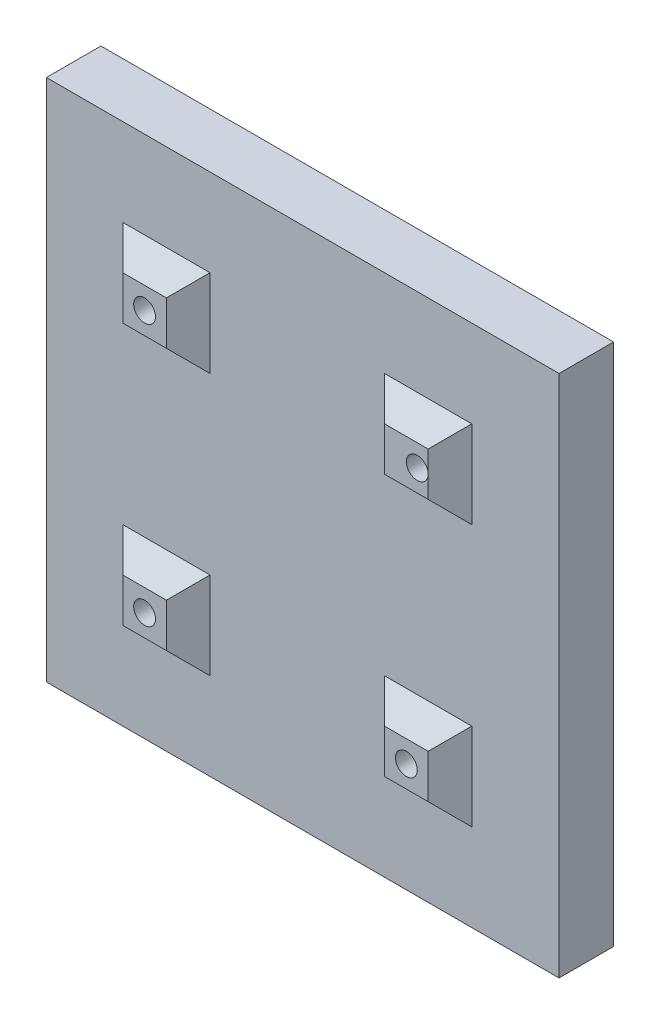
ISO-10303-21;
HEADER;
FILE_DESCRIPTION(('STEP AP214'),'2;1');
FILE_NAME('part.step','',(''),(''),'','','');
FILE_SCHEMA(('AUTOMOTIVE_DESIGN { 1 0 10303 214 1 1 1 1 }'));
ENDSEC;
DATA;
#1=APPLICATION_CONTEXT('core data for automotive mechanical design processes');
#2=APPLICATION_PROTOCOL_DEFINITION('international standard','automotive_design',2000,#1);
#3=PRODUCT_CONTEXT('',#1,'mechanical');
#4=PRODUCT('Part','Part','',(#3));
#5=PRODUCT_RELATED_PRODUCT_CATEGORY('part','',(#4));
#6=PRODUCT_DEFINITION_FORMATION('','',#4);
#7=PRODUCT_DEFINITION_CONTEXT('part definition',#1,'design');
#8=PRODUCT_DEFINITION('design','',#6,#7);
#9=PRODUCT_DEFINITION_SHAPE('','',#8);
#10=(LENGTH_UNIT() NAMED_UNIT(*) SI_UNIT(.MILLI.,.METRE.));
#11=(NAMED_UNIT(*) PLANE_ANGLE_UNIT() SI_UNIT($,.RADIAN.));
#12=(NAMED_UNIT(*) SI_UNIT($,.STERADIAN.) SOLID_ANGLE_UNIT());
#13=UNCERTAINTY_MEASURE_WITH_UNIT(LENGTH_MEASURE(1.E-05),#10,'distance_accuracy_value','');
#14=(GEOMETRIC_REPRESENTATION_CONTEXT(3) GLOBAL_UNCERTAINTY_ASSIGNED_CONTEXT((#13)) GLOBAL_UNIT_ASSIGNED_CONTEXT((#10,
#11,#12)) REPRESENTATION_CONTEXT('',''));
#15=CARTESIAN_POINT('',(0.,0.,0.));
#16=DIRECTION('',(0.,0.,1.));
#17=DIRECTION('',(1.,0.,0.));
#18=AXIS2_PLACEMENT_3D('',#15,#16,#17);
#19=CARTESIAN_POINT('',(11.75,12.,3.5));
#20=DIRECTION('',(-1.,0.,0.));
#21=DIRECTION('',(0.,-1.,0.));
#22=AXIS2_PLACEMENT_3D('',#19,#20,#21);
#23=PLANE('',#22);
#24=DIRECTION('',(0.,1.,0.));
#25=VECTOR('',#24,1.);
#26=CARTESIAN_POINT('',(11.75,12.,2.5));
#27=LINE('',#26,#25);
#28=CARTESIAN_POINT('',(11.75,-12.,2.5));
#29=VERTEX_POINT('',#28);
#30=CARTESIAN_POINT('',(11.75,12.,2.5));
#31=VERTEX_POINT('',#30);
#32=EDGE_CURVE('E187',#29,#31,#27,.T.);
#33=ORIENTED_EDGE('',*,*,#32,.F.);
#34=DIRECTION('',(0.,0.,-1.));
#35=VECTOR('',#34,1.);
#36=CARTESIAN_POINT('',(11.75,-12.,3.5));
#37=LINE('',#36,#35);
#38=CARTESIAN_POINT('',(11.75,-12.,0.));
#39=VERTEX_POINT('',#38);
#40=EDGE_CURVE('E199',#29,#39,#37,.T.);
#41=ORIENTED_EDGE('',*,*,#40,.T.);
#42=DIRECTION('',(0.,1.,0.));
#43=VECTOR('',#42,1.);
#44=CARTESIAN_POINT('',(11.75,12.,0.));
#45=LINE('',#44,#43);
#46=CARTESIAN_POINT('',(11.75,12.,0.));
#47=VERTEX_POINT('',#46);
#48=EDGE_CURVE('E198',#39,#47,#45,.T.);
#49=ORIENTED_EDGE('',*,*,#48,.T.);
#50=DIRECTION('',(0.,0.,-1.));
#51=VECTOR('',#50,1.);
#52=CARTESIAN_POINT('',(11.75,12.,3.5));
#53=LINE('',#52,#51);
#54=EDGE_CURVE('E11',#31,#47,#53,.T.);
#55=ORIENTED_EDGE('',*,*,#54,.F.);
#56=EDGE_LOOP('',(#33,#41,#49,#55));
#57=FACE_BOUND('',#56,.T.);
#58=ADVANCED_FACE('F41',(#57),#23,.F.);
#59=CARTESIAN_POINT('',(-11.75,12.,3.5));
#60=DIRECTION('',(0.,-1.,0.));
#61=DIRECTION('',(0.,0.,-1.));
#62=AXIS2_PLACEMENT_3D('',#59,#60,#61);
#63=PLANE('',#62);
#64=DIRECTION('',(-1.,0.,0.));
#65=VECTOR('',#64,1.);
#66=CARTESIAN_POINT('',(-12.25,12.,2.5));
#67=LINE('',#66,#65);
#68=CARTESIAN_POINT('',(-11.75,12.,2.5));
#69=VERTEX_POINT('',#68);
#70=EDGE_CURVE('E179',#31,#69,#67,.T.);
#71=ORIENTED_EDGE('',*,*,#70,.F.);
#72=ORIENTED_EDGE('',*,*,#54,.T.);
#73=DIRECTION('',(-1.,0.,0.));
#74=VECTOR('',#73,1.);
#75=CARTESIAN_POINT('',(-11.75,12.,0.));
#76=LINE('',#75,#74);
#77=CARTESIAN_POINT('',(-11.75,12.,0.));
#78=VERTEX_POINT('',#77);
#79=EDGE_CURVE('E203',#47,#78,#76,.T.);
#80=ORIENTED_EDGE('',*,*,#79,.T.);
#81=DIRECTION('',(0.,0.,-1.));
#82=VECTOR('',#81,1.);
#83=CARTESIAN_POINT('',(-11.75,12.,3.5));
#84=LINE('',#83,#82);
#85=EDGE_CURVE('E49',#69,#78,#84,.T.);
#86=ORIENTED_EDGE('',*,*,#85,.F.);
#87=EDGE_LOOP('',(#71,#72,#80,#86));
#88=FACE_BOUND('',#87,.T.);
#89=ADVANCED_FACE('F181',(#88),#63,.F.);
#90=CARTESIAN_POINT('',(-11.75,12.,3.5));
#91=DIRECTION('',(1.,0.,0.));
#92=DIRECTION('',(0.,1.,0.));
#93=AXIS2_PLACEMENT_3D('',#90,#91,#92);
#94=PLANE('',#93);
#95=DIRECTION('',(0.,-1.,0.));
#96=VECTOR('',#95,1.);
#97=CARTESIAN_POINT('',(-11.75,12.,2.5));
#98=LINE('',#97,#96);
#99=CARTESIAN_POINT('',(-11.75,-12.,2.5));
#100=VERTEX_POINT('',#99);
#101=EDGE_CURVE('E62',#69,#100,#98,.T.);
#102=ORIENTED_EDGE('',*,*,#101,.F.);
#103=ORIENTED_EDGE('',*,*,#85,.T.);
#104=DIRECTION('',(0.,-1.,0.));
#105=VECTOR('',#104,1.);
#106=CARTESIAN_POINT('',(-11.75,12.,0.));
#107=LINE('',#106,#105);
#108=CARTESIAN_POINT('',(-11.75,-12.,0.));
#109=VERTEX_POINT('',#108);
#110=EDGE_CURVE('E205',#78,#109,#107,.T.);
#111=ORIENTED_EDGE('',*,*,#110,.T.);
#112=DIRECTION('',(0.,0.,-1.));
#113=VECTOR('',#112,1.);
#114=CARTESIAN_POINT('',(-11.75,-12.,3.5));
#115=LINE('',#114,#113);
#116=EDGE_CURVE('E216',#100,#109,#115,.T.);
#117=ORIENTED_EDGE('',*,*,#116,.F.);
#118=EDGE_LOOP('',(#102,#103,#111,#117));
#119=FACE_BOUND('',#118,.T.);
#120=ADVANCED_FACE('F443',(#119),#94,.F.);
#121=CARTESIAN_POINT('',(-11.75,-12.,3.5));
#122=DIRECTION('',(0.,1.,0.));
#123=DIRECTION('',(0.,0.,1.));
#124=AXIS2_PLACEMENT_3D('',#121,#122,#123);
#125=PLANE('',#124);
#126=DIRECTION('',(1.,0.,0.));
#127=VECTOR('',#126,1.);
#128=CARTESIAN_POINT('',(-12.25,-12.,2.5));
#129=LINE('',#128,#127);
#130=EDGE_CURVE('E186',#100,#29,#129,.T.);
#131=ORIENTED_EDGE('',*,*,#130,.F.);
#132=ORIENTED_EDGE('',*,*,#116,.T.);
#133=DIRECTION('',(1.,0.,0.));
#134=VECTOR('',#133,1.);
#135=CARTESIAN_POINT('',(-11.75,-12.,0.));
#136=LINE('',#135,#134);
#137=EDGE_CURVE('E213',#109,#39,#136,.T.);
#138=ORIENTED_EDGE('',*,*,#137,.T.);
#139=ORIENTED_EDGE('',*,*,#40,.F.);
#140=EDGE_LOOP('',(#131,#132,#138,#139));
#141=FACE_BOUND('',#140,.T.);
#142=ADVANCED_FACE('F447',(#141),#125,.F.);
#143=CARTESIAN_POINT('',(0.,0.,0.));
#144=DIRECTION('',(0.,0.,1.));
#145=DIRECTION('',(1.,0.,0.));
#146=AXIS2_PLACEMENT_3D('',#143,#144,#145);
#147=PLANE('',#146);
#148=CARTESIAN_POINT('',(-6.25,-6.,0.));
#149=DIRECTION('',(0.,0.,1.));
#150=DIRECTION('',(1.,0.,0.));
#151=AXIS2_PLACEMENT_3D('',#148,#149,#150);
#152=CIRCLE('',#151,0.499999999999997);
#153=CARTESIAN_POINT('',(-5.75,-6.,0.));
#154=VERTEX_POINT('',#153);
#155=EDGE_CURVE('E44',#154,#154,#152,.T.);
#156=ORIENTED_EDGE('',*,*,#155,.T.);
#157=EDGE_LOOP('',(#156));
#158=FACE_BOUND('',#157,.T.);
#159=CARTESIAN_POINT('',(-6.25,6.,0.));
#160=DIRECTION('',(0.,0.,1.));
#161=DIRECTION('',(1.,0.,0.));
#162=AXIS2_PLACEMENT_3D('',#159,#160,#161);
#163=CIRCLE('',#162,0.499999999999998);
#164=CARTESIAN_POINT('',(-5.75,6.,0.));
#165=VERTEX_POINT('',#164);
#166=EDGE_CURVE('E218',#165,#165,#163,.T.);
#167=ORIENTED_EDGE('',*,*,#166,.T.);
#168=EDGE_LOOP('',(#167));
#169=FACE_BOUND('',#168,.T.);
#170=CARTESIAN_POINT('',(6.25000000000001,5.99999999999999,0.));
#171=DIRECTION('',(0.,0.,1.));
#172=DIRECTION('',(1.,0.,0.));
#173=AXIS2_PLACEMENT_3D('',#170,#171,#172);
#174=CIRCLE('',#173,0.499999999999998);
#175=CARTESIAN_POINT('',(6.75000000000001,5.99999999999999,0.));
#176=VERTEX_POINT('',#175);
#177=EDGE_CURVE('E223',#176,#176,#174,.T.);
#178=ORIENTED_EDGE('',*,*,#177,.T.);
#179=EDGE_LOOP('',(#178));
#180=FACE_BOUND('',#179,.T.);
#181=CARTESIAN_POINT('',(5.74999999999999,-6.,0.));
#182=DIRECTION('',(0.,0.,1.));
#183=DIRECTION('',(1.,0.,0.));
#184=AXIS2_PLACEMENT_3D('',#181,#182,#183);
#185=CIRCLE('',#184,0.499999999999998);
#186=CARTESIAN_POINT('',(6.24999999999999,-6.,0.));
#187=VERTEX_POINT('',#186);
#188=EDGE_CURVE('E238',#187,#187,#185,.T.);
#189=ORIENTED_EDGE('',*,*,#188,.T.);
#190=EDGE_LOOP('',(#189));
#191=FACE_BOUND('',#190,.T.);
#192=ORIENTED_EDGE('',*,*,#48,.F.);
#193=ORIENTED_EDGE('',*,*,#137,.F.);
#194=ORIENTED_EDGE('',*,*,#110,.F.);
#195=ORIENTED_EDGE('',*,*,#79,.F.);
#196=EDGE_LOOP('',(#192,#193,#194,#195));
#197=FACE_BOUND('',#196,.T.);
#198=ADVANCED_FACE('F453',(#158,#169,#180,#191,#197),#147,.F.);
#199=CARTESIAN_POINT('',(-0.250000000000002,0.,2.5));
#200=DIRECTION('',(0.,0.,1.));
#201=DIRECTION('',(1.,0.,0.));
#202=AXIS2_PLACEMENT_3D('',#199,#200,#201);
#203=PLANE('',#202);
#204=DIRECTION('',(0.,-1.,0.));
#205=VECTOR('',#204,1.);
#206=CARTESIAN_POINT('',(3.75,5.,2.5));
#207=LINE('',#206,#205);
#208=CARTESIAN_POINT('',(3.74999999999999,8.00000000000001,2.5));
#209=VERTEX_POINT('',#208);
#210=CARTESIAN_POINT('',(3.75,4.,2.5));
#211=VERTEX_POINT('',#210);
#212=EDGE_CURVE('E254',#209,#211,#207,.T.);
#213=ORIENTED_EDGE('',*,*,#212,.F.);
#214=DIRECTION('',(-1.,0.,0.));
#215=VECTOR('',#214,1.);
#216=CARTESIAN_POINT('',(4.75,8.00000000000001,2.5));
#217=LINE('',#216,#215);
#218=CARTESIAN_POINT('',(7.75,8.00000000000001,2.5));
#219=VERTEX_POINT('',#218);
#220=EDGE_CURVE('E251',#219,#209,#217,.T.);
#221=ORIENTED_EDGE('',*,*,#220,.F.);
#222=DIRECTION('',(0.,1.,0.));
#223=VECTOR('',#222,1.);
#224=CARTESIAN_POINT('',(7.75,7.,2.5));
#225=LINE('',#224,#223);
#226=CARTESIAN_POINT('',(7.75,4.,2.5));
#227=VERTEX_POINT('',#226);
#228=EDGE_CURVE('E248',#227,#219,#225,.T.);
#229=ORIENTED_EDGE('',*,*,#228,.F.);
#230=DIRECTION('',(1.,0.,0.));
#231=VECTOR('',#230,1.);
#232=CARTESIAN_POINT('',(6.75,4.,2.5));
#233=LINE('',#232,#231);
#234=EDGE_CURVE('E257',#211,#227,#233,.T.);
#235=ORIENTED_EDGE('',*,*,#234,.F.);
#236=EDGE_LOOP('',(#213,#221,#229,#235));
#237=FACE_BOUND('',#236,.T.);
#238=DIRECTION('',(-1.,0.,0.));
#239=VECTOR('',#238,1.);
#240=CARTESIAN_POINT('',(-7.25,8.00000000000001,2.5));
#241=LINE('',#240,#239);
#242=CARTESIAN_POINT('',(-4.25,8.00000000000001,2.5));
#243=VERTEX_POINT('',#242);
#244=CARTESIAN_POINT('',(-8.25,8.00000000000001,2.5));
#245=VERTEX_POINT('',#244);
#246=EDGE_CURVE('E261',#243,#245,#241,.T.);
#247=ORIENTED_EDGE('',*,*,#246,.F.);
#248=DIRECTION('',(0.,1.,0.));
#249=VECTOR('',#248,1.);
#250=CARTESIAN_POINT('',(-4.25,7.,2.5));
#251=LINE('',#250,#249);
#252=CARTESIAN_POINT('',(-4.25,4.,2.5));
#253=VERTEX_POINT('',#252);
#254=EDGE_CURVE('E264',#253,#243,#251,.T.);
#255=ORIENTED_EDGE('',*,*,#254,.F.);
#256=DIRECTION('',(1.,0.,0.));
#257=VECTOR('',#256,1.);
#258=CARTESIAN_POINT('',(-5.25,4.,2.5));
#259=LINE('',#258,#257);
#260=CARTESIAN_POINT('',(-8.25,4.,2.5));
#261=VERTEX_POINT('',#260);
#262=EDGE_CURVE('E267',#261,#253,#259,.T.);
#263=ORIENTED_EDGE('',*,*,#262,.F.);
#264=DIRECTION('',(0.,-1.,0.));
#265=VECTOR('',#264,1.);
#266=CARTESIAN_POINT('',(-8.25,5.,2.5));
#267=LINE('',#266,#265);
#268=EDGE_CURVE('E270',#245,#261,#267,.T.);
#269=ORIENTED_EDGE('',*,*,#268,.F.);
#270=EDGE_LOOP('',(#247,#255,#263,#269));
#271=FACE_BOUND('',#270,.T.);
#272=DIRECTION('',(-1.,0.,0.));
#273=VECTOR('',#272,1.);
#274=CARTESIAN_POINT('',(-7.25,-4.,2.5));
#275=LINE('',#274,#273);
#276=CARTESIAN_POINT('',(-4.24999999999999,-4.,2.5));
#277=VERTEX_POINT('',#276);
#278=CARTESIAN_POINT('',(-8.25,-4.,2.5));
#279=VERTEX_POINT('',#278);
#280=EDGE_CURVE('E274',#277,#279,#275,.T.);
#281=ORIENTED_EDGE('',*,*,#280,.F.);
#282=DIRECTION('',(0.,1.,0.));
#283=VECTOR('',#282,1.);
#284=CARTESIAN_POINT('',(-4.25,-5.,2.5));
#285=LINE('',#284,#283);
#286=CARTESIAN_POINT('',(-4.25,-8.,2.5));
#287=VERTEX_POINT('',#286);
#288=EDGE_CURVE('E277',#287,#277,#285,.T.);
#289=ORIENTED_EDGE('',*,*,#288,.F.);
#290=DIRECTION('',(1.,0.,0.));
#291=VECTOR('',#290,1.);
#292=CARTESIAN_POINT('',(-5.25,-8.,2.5));
#293=LINE('',#292,#291);
#294=CARTESIAN_POINT('',(-8.25,-8.,2.5));
#295=VERTEX_POINT('',#294);
#296=EDGE_CURVE('E280',#295,#287,#293,.T.);
#297=ORIENTED_EDGE('',*,*,#296,.F.);
#298=DIRECTION('',(0.,-1.,0.));
#299=VECTOR('',#298,1.);
#300=CARTESIAN_POINT('',(-8.25,-7.,2.5));
#301=LINE('',#300,#299);
#302=EDGE_CURVE('E283',#279,#295,#301,.T.);
#303=ORIENTED_EDGE('',*,*,#302,.F.);
#304=EDGE_LOOP('',(#281,#289,#297,#303));
#305=FACE_BOUND('',#304,.T.);
#306=DIRECTION('',(0.,-1.,0.));
#307=VECTOR('',#306,1.);
#308=CARTESIAN_POINT('',(3.74999999999999,-7.,2.5));
#309=LINE('',#308,#307);
#310=CARTESIAN_POINT('',(3.74999999999999,-4.,2.5));
#311=VERTEX_POINT('',#310);
#312=CARTESIAN_POINT('',(3.74999999999999,-8.,2.5));
#313=VERTEX_POINT('',#312);
#314=EDGE_CURVE('E287',#311,#313,#309,.T.);
#315=ORIENTED_EDGE('',*,*,#314,.F.);
#316=DIRECTION('',(-1.,0.,0.));
#317=VECTOR('',#316,1.);
#318=CARTESIAN_POINT('',(4.74999999999999,-4.,2.5));
#319=LINE('',#318,#317);
#320=CARTESIAN_POINT('',(7.74999999999999,-4.,2.5));
#321=VERTEX_POINT('',#320);
#322=EDGE_CURVE('E290',#321,#311,#319,.T.);
#323=ORIENTED_EDGE('',*,*,#322,.F.);
#324=DIRECTION('',(0.,1.,0.));
#325=VECTOR('',#324,1.);
#326=CARTESIAN_POINT('',(7.74999999999999,-5.,2.5));
#327=LINE('',#326,#325);
#328=CARTESIAN_POINT('',(7.74999999999999,-8.,2.5));
#329=VERTEX_POINT('',#328);
#330=EDGE_CURVE('E293',#329,#321,#327,.T.);
#331=ORIENTED_EDGE('',*,*,#330,.F.);
#332=DIRECTION('',(1.,0.,0.));
#333=VECTOR('',#332,1.);
#334=CARTESIAN_POINT('',(6.74999999999999,-8.,2.5));
#335=LINE('',#334,#333);
#336=EDGE_CURVE('E296',#313,#329,#335,.T.);
#337=ORIENTED_EDGE('',*,*,#336,.F.);
#338=EDGE_LOOP('',(#315,#323,#331,#337));
#339=FACE_BOUND('',#338,.T.);
#340=ORIENTED_EDGE('',*,*,#101,.T.);
#341=ORIENTED_EDGE('',*,*,#130,.T.);
#342=ORIENTED_EDGE('',*,*,#32,.T.);
#343=ORIENTED_EDGE('',*,*,#70,.T.);
#344=EDGE_LOOP('',(#340,#341,#342,#343));
#345=FACE_BOUND('',#344,.T.);
#346=ADVANCED_FACE('F190',(#237,#271,#305,#339,#345),#203,.T.);
#347=CARTESIAN_POINT('',(6.74999999999999,-5.,3.5));
#348=DIRECTION('',(0.,-0.707106781186547,-0.707106781186547));
#349=DIRECTION('',(-1.,0.,0.));
#350=AXIS2_PLACEMENT_3D('',#347,#348,#349);
#351=PLANE('',#350);
#352=DIRECTION('',(0.577350269189627,-0.577350269189625,0.577350269189625));
#353=VECTOR('',#352,1.);
#354=CARTESIAN_POINT('',(5.41666666666666,-5.66666666666667,4.16666666666667));
#355=LINE('',#354,#353);
#356=CARTESIAN_POINT('',(4.74999999999999,-5.,3.5));
#357=VERTEX_POINT('',#356);
#358=EDGE_CURVE('E359',#311,#357,#355,.T.);
#359=ORIENTED_EDGE('',*,*,#358,.T.);
#360=DIRECTION('',(1.,0.,0.));
#361=VECTOR('',#360,1.);
#362=CARTESIAN_POINT('',(6.74999999999999,-5.,3.5));
#363=LINE('',#362,#361);
#364=CARTESIAN_POINT('',(6.74999999999999,-5.,3.5));
#365=VERTEX_POINT('',#364);
#366=EDGE_CURVE('E304',#357,#365,#363,.T.);
#367=ORIENTED_EDGE('',*,*,#366,.T.);
#368=DIRECTION('',(-0.577350269189626,-0.577350269189626,0.577350269189626));
#369=VECTOR('',#368,1.);
#370=CARTESIAN_POINT('',(6.74999999999999,-5.,3.5));
#371=LINE('',#370,#369);
#372=EDGE_CURVE('E194',#365,#321,#371,.F.);
#373=ORIENTED_EDGE('',*,*,#372,.T.);
#374=ORIENTED_EDGE('',*,*,#322,.T.);
#375=EDGE_LOOP('',(#359,#367,#373,#374));
#376=FACE_BOUND('',#375,.T.);
#377=ADVANCED_FACE('F507',(#376),#351,.F.);
#378=CARTESIAN_POINT('',(6.74999999999999,-5.,3.5));
#379=DIRECTION('',(-0.707106781186548,0.,-0.707106781186547));
#380=DIRECTION('',(0.,1.,0.));
#381=AXIS2_PLACEMENT_3D('',#378,#379,#380);
#382=PLANE('',#381);
#383=ORIENTED_EDGE('',*,*,#372,.F.);
#384=DIRECTION('',(0.,-1.,0.));
#385=VECTOR('',#384,1.);
#386=CARTESIAN_POINT('',(6.74999999999999,-7.,3.5));
#387=LINE('',#386,#385);
#388=CARTESIAN_POINT('',(6.74999999999999,-7.,3.5));
#389=VERTEX_POINT('',#388);
#390=EDGE_CURVE('E300',#365,#389,#387,.T.);
#391=ORIENTED_EDGE('',*,*,#390,.T.);
#392=DIRECTION('',(-0.577350269189625,0.577350269189626,0.577350269189626));
#393=VECTOR('',#392,1.);
#394=CARTESIAN_POINT('',(6.74999999999999,-7.,3.5));
#395=LINE('',#394,#393);
#396=EDGE_CURVE('E355',#389,#329,#395,.F.);
#397=ORIENTED_EDGE('',*,*,#396,.T.);
#398=ORIENTED_EDGE('',*,*,#330,.T.);
#399=EDGE_LOOP('',(#383,#391,#397,#398));
#400=FACE_BOUND('',#399,.T.);
#401=ADVANCED_FACE('F529',(#400),#382,.F.);
#402=CARTESIAN_POINT('',(4.74999999999999,-5.,3.5));
#403=DIRECTION('',(0.707106781186547,0.,-0.707106781186548));
#404=DIRECTION('',(0.,-1.,0.));
#405=AXIS2_PLACEMENT_3D('',#402,#403,#404);
#406=PLANE('',#405);
#407=ORIENTED_EDGE('',*,*,#358,.F.);
#408=ORIENTED_EDGE('',*,*,#314,.T.);
#409=DIRECTION('',(-0.577350269189626,-0.577350269189626,-0.577350269189625));
#410=VECTOR('',#409,1.);
#411=CARTESIAN_POINT('',(5.41666666666666,-6.33333333333333,4.16666666666667));
#412=LINE('',#411,#410);
#413=CARTESIAN_POINT('',(4.75,-7.,3.5));
#414=VERTEX_POINT('',#413);
#415=EDGE_CURVE('E352',#313,#414,#412,.F.);
#416=ORIENTED_EDGE('',*,*,#415,.T.);
#417=DIRECTION('',(0.,1.,0.));
#418=VECTOR('',#417,1.);
#419=CARTESIAN_POINT('',(4.74999999999999,-5.,3.5));
#420=LINE('',#419,#418);
#421=EDGE_CURVE('E307',#414,#357,#420,.T.);
#422=ORIENTED_EDGE('',*,*,#421,.T.);
#423=EDGE_LOOP('',(#407,#408,#416,#422));
#424=FACE_BOUND('',#423,.T.);
#425=ADVANCED_FACE('F520',(#424),#406,.F.);
#426=CARTESIAN_POINT('',(6.74999999999999,-7.,3.5));
#427=DIRECTION('',(0.,0.707106781186547,-0.707106781186548));
#428=DIRECTION('',(1.,0.,0.));
#429=AXIS2_PLACEMENT_3D('',#426,#427,#428);
#430=PLANE('',#429);
#431=ORIENTED_EDGE('',*,*,#396,.F.);
#432=DIRECTION('',(-1.,0.,0.));
#433=VECTOR('',#432,1.);
#434=CARTESIAN_POINT('',(4.75,-7.,3.5));
#435=LINE('',#434,#433);
#436=EDGE_CURVE('E244',#389,#414,#435,.T.);
#437=ORIENTED_EDGE('',*,*,#436,.T.);
#438=ORIENTED_EDGE('',*,*,#415,.F.);
#439=ORIENTED_EDGE('',*,*,#336,.T.);
#440=EDGE_LOOP('',(#431,#437,#438,#439));
#441=FACE_BOUND('',#440,.T.);
#442=ADVANCED_FACE('F531',(#441),#430,.F.);
#443=CARTESIAN_POINT('',(-5.25,-5.,3.5));
#444=DIRECTION('',(-0.707106781186547,0.,-0.707106781186548));
#445=DIRECTION('',(0.,1.,0.));
#446=AXIS2_PLACEMENT_3D('',#443,#444,#445);
#447=PLANE('',#446);
#448=DIRECTION('',(-0.577350269189627,-0.577350269189625,0.577350269189625));
#449=VECTOR('',#448,1.);
#450=CARTESIAN_POINT('',(-5.25,-5.,3.5));
#451=LINE('',#450,#449);
#452=CARTESIAN_POINT('',(-5.25,-5.,3.5));
#453=VERTEX_POINT('',#452);
#454=EDGE_CURVE('E373',#277,#453,#451,.T.);
#455=ORIENTED_EDGE('',*,*,#454,.T.);
#456=DIRECTION('',(0.,-1.,0.));
#457=VECTOR('',#456,1.);
#458=CARTESIAN_POINT('',(-5.25,-7.,3.5));
#459=LINE('',#458,#457);
#460=CARTESIAN_POINT('',(-5.25,-7.,3.5));
#461=VERTEX_POINT('',#460);
#462=EDGE_CURVE('E318',#453,#461,#459,.T.);
#463=ORIENTED_EDGE('',*,*,#462,.T.);
#464=DIRECTION('',(-0.577350269189626,0.577350269189626,0.577350269189625));
#465=VECTOR('',#464,1.);
#466=CARTESIAN_POINT('',(-5.91666666666667,-6.33333333333333,4.16666666666667));
#467=LINE('',#466,#465);
#468=EDGE_CURVE('E356',#461,#287,#467,.F.);
#469=ORIENTED_EDGE('',*,*,#468,.T.);
#470=ORIENTED_EDGE('',*,*,#288,.T.);
#471=EDGE_LOOP('',(#455,#463,#469,#470));
#472=FACE_BOUND('',#471,.T.);
#473=ADVANCED_FACE('F477',(#472),#447,.F.);
#474=CARTESIAN_POINT('',(-7.25,-7.,3.5));
#475=DIRECTION('',(0.,0.707106781186547,-0.707106781186548));
#476=DIRECTION('',(1.,0.,0.));
#477=AXIS2_PLACEMENT_3D('',#474,#475,#476);
#478=PLANE('',#477);
#479=ORIENTED_EDGE('',*,*,#468,.F.);
#480=DIRECTION('',(-1.,0.,0.));
#481=VECTOR('',#480,1.);
#482=CARTESIAN_POINT('',(-7.25,-7.,3.5));
#483=LINE('',#482,#481);
#484=CARTESIAN_POINT('',(-7.25,-7.,3.5));
#485=VERTEX_POINT('',#484);
#486=EDGE_CURVE('E314',#461,#485,#483,.T.);
#487=ORIENTED_EDGE('',*,*,#486,.T.);
#488=DIRECTION('',(0.577350269189625,0.577350269189626,0.577350269189626));
#489=VECTOR('',#488,1.);
#490=CARTESIAN_POINT('',(-6.58333333333333,-6.33333333333333,4.16666666666667));
#491=LINE('',#490,#489);
#492=EDGE_CURVE('E369',#485,#295,#491,.F.);
#493=ORIENTED_EDGE('',*,*,#492,.T.);
#494=ORIENTED_EDGE('',*,*,#296,.T.);
#495=EDGE_LOOP('',(#479,#487,#493,#494));
#496=FACE_BOUND('',#495,.T.);
#497=ADVANCED_FACE('F538',(#496),#478,.F.);
#498=CARTESIAN_POINT('',(-7.25,-5.,3.5));
#499=DIRECTION('',(0.,-0.707106781186547,-0.707106781186547));
#500=DIRECTION('',(-1.,0.,0.));
#501=AXIS2_PLACEMENT_3D('',#498,#499,#500);
#502=PLANE('',#501);
#503=ORIENTED_EDGE('',*,*,#454,.F.);
#504=ORIENTED_EDGE('',*,*,#280,.T.);
#505=DIRECTION('',(-0.577350269189626,0.577350269189626,-0.577350269189626));
#506=VECTOR('',#505,1.);
#507=CARTESIAN_POINT('',(-7.25,-5.,3.5));
#508=LINE('',#507,#506);
#509=CARTESIAN_POINT('',(-7.25,-5.,3.5));
#510=VERTEX_POINT('',#509);
#511=EDGE_CURVE('E366',#279,#510,#508,.F.);
#512=ORIENTED_EDGE('',*,*,#511,.T.);
#513=DIRECTION('',(1.,0.,0.));
#514=VECTOR('',#513,1.);
#515=CARTESIAN_POINT('',(-5.25,-5.,3.5));
#516=LINE('',#515,#514);
#517=EDGE_CURVE('E321',#510,#453,#516,.T.);
#518=ORIENTED_EDGE('',*,*,#517,.T.);
#519=EDGE_LOOP('',(#503,#504,#512,#518));
#520=FACE_BOUND('',#519,.T.);
#521=ADVANCED_FACE('F490',(#520),#502,.F.);
#522=CARTESIAN_POINT('',(-7.25,-5.,3.5));
#523=DIRECTION('',(0.707106781186548,0.,-0.707106781186547));
#524=DIRECTION('',(0.,-1.,0.));
#525=AXIS2_PLACEMENT_3D('',#522,#523,#524);
#526=PLANE('',#525);
#527=ORIENTED_EDGE('',*,*,#492,.F.);
#528=DIRECTION('',(0.,1.,0.));
#529=VECTOR('',#528,1.);
#530=CARTESIAN_POINT('',(-7.25,-5.,3.5));
#531=LINE('',#530,#529);
#532=EDGE_CURVE('E310',#485,#510,#531,.T.);
#533=ORIENTED_EDGE('',*,*,#532,.T.);
#534=ORIENTED_EDGE('',*,*,#511,.F.);
#535=ORIENTED_EDGE('',*,*,#302,.T.);
#536=EDGE_LOOP('',(#527,#533,#534,#535));
#537=FACE_BOUND('',#536,.T.);
#538=ADVANCED_FACE('F485',(#537),#526,.F.);
#539=CARTESIAN_POINT('',(-5.25,7.,3.5));
#540=DIRECTION('',(-0.707106781186547,0.,-0.707106781186548));
#541=DIRECTION('',(0.,1.,0.));
#542=AXIS2_PLACEMENT_3D('',#539,#540,#541);
#543=PLANE('',#542);
#544=DIRECTION('',(-0.577350269189626,-0.577350269189626,0.577350269189626));
#545=VECTOR('',#544,1.);
#546=CARTESIAN_POINT('',(-5.25,7.,3.5));
#547=LINE('',#546,#545);
#548=CARTESIAN_POINT('',(-5.25,7.,3.5));
#549=VERTEX_POINT('',#548);
#550=EDGE_CURVE('E387',#243,#549,#547,.T.);
#551=ORIENTED_EDGE('',*,*,#550,.T.);
#552=DIRECTION('',(0.,-1.,0.));
#553=VECTOR('',#552,1.);
#554=CARTESIAN_POINT('',(-5.25,5.,3.5));
#555=LINE('',#554,#553);
#556=CARTESIAN_POINT('',(-5.25,5.,3.5));
#557=VERTEX_POINT('',#556);
#558=EDGE_CURVE('E332',#549,#557,#555,.T.);
#559=ORIENTED_EDGE('',*,*,#558,.T.);
#560=DIRECTION('',(-0.577350269189626,0.577350269189626,0.577350269189626));
#561=VECTOR('',#560,1.);
#562=CARTESIAN_POINT('',(-5.91666666666667,5.66666666666667,4.16666666666667));
#563=LINE('',#562,#561);
#564=EDGE_CURVE('E370',#557,#253,#563,.F.);
#565=ORIENTED_EDGE('',*,*,#564,.T.);
#566=ORIENTED_EDGE('',*,*,#254,.T.);
#567=EDGE_LOOP('',(#551,#559,#565,#566));
#568=FACE_BOUND('',#567,.T.);
#569=ADVANCED_FACE('F482',(#568),#543,.F.);
#570=CARTESIAN_POINT('',(-7.25,5.,3.5));
#571=DIRECTION('',(0.,0.707106781186547,-0.707106781186547));
#572=DIRECTION('',(1.,0.,0.));
#573=AXIS2_PLACEMENT_3D('',#570,#571,#572);
#574=PLANE('',#573);
#575=ORIENTED_EDGE('',*,*,#564,.F.);
#576=DIRECTION('',(-1.,0.,0.));
#577=VECTOR('',#576,1.);
#578=CARTESIAN_POINT('',(-7.25,5.,3.5));
#579=LINE('',#578,#577);
#580=CARTESIAN_POINT('',(-7.25,5.,3.5));
#581=VERTEX_POINT('',#580);
#582=EDGE_CURVE('E328',#557,#581,#579,.T.);
#583=ORIENTED_EDGE('',*,*,#582,.T.);
#584=DIRECTION('',(0.577350269189626,0.577350269189626,0.577350269189626));
#585=VECTOR('',#584,1.);
#586=CARTESIAN_POINT('',(-6.58333333333333,5.66666666666667,4.16666666666667));
#587=LINE('',#586,#585);
#588=EDGE_CURVE('E383',#581,#261,#587,.F.);
#589=ORIENTED_EDGE('',*,*,#588,.T.);
#590=ORIENTED_EDGE('',*,*,#262,.T.);
#591=EDGE_LOOP('',(#575,#583,#589,#590));
#592=FACE_BOUND('',#591,.T.);
#593=ADVANCED_FACE('F473',(#592),#574,.F.);
#594=CARTESIAN_POINT('',(-7.25,7.,3.5));
#595=DIRECTION('',(0.,-0.707106781186547,-0.707106781186547));
#596=DIRECTION('',(-1.,0.,0.));
#597=AXIS2_PLACEMENT_3D('',#594,#595,#596);
#598=PLANE('',#597);
#599=ORIENTED_EDGE('',*,*,#550,.F.);
#600=ORIENTED_EDGE('',*,*,#246,.T.);
#601=DIRECTION('',(-0.577350269189626,0.577350269189626,-0.577350269189626));
#602=VECTOR('',#601,1.);
#603=CARTESIAN_POINT('',(-7.25,7.,3.5));
#604=LINE('',#603,#602);
#605=CARTESIAN_POINT('',(-7.25,7.,3.5));
#606=VERTEX_POINT('',#605);
#607=EDGE_CURVE('E380',#245,#606,#604,.F.);
#608=ORIENTED_EDGE('',*,*,#607,.T.);
#609=DIRECTION('',(1.,0.,0.));
#610=VECTOR('',#609,1.);
#611=CARTESIAN_POINT('',(-5.25,7.,3.5));
#612=LINE('',#611,#610);
#613=EDGE_CURVE('E335',#606,#549,#612,.T.);
#614=ORIENTED_EDGE('',*,*,#613,.T.);
#615=EDGE_LOOP('',(#599,#600,#608,#614));
#616=FACE_BOUND('',#615,.T.);
#617=ADVANCED_FACE('F467',(#616),#598,.F.);
#618=CARTESIAN_POINT('',(-7.25,7.,3.5));
#619=DIRECTION('',(0.707106781186547,0.,-0.707106781186548));
#620=DIRECTION('',(0.,-1.,0.));
#621=AXIS2_PLACEMENT_3D('',#618,#619,#620);
#622=PLANE('',#621);
#623=ORIENTED_EDGE('',*,*,#588,.F.);
#624=DIRECTION('',(0.,1.,0.));
#625=VECTOR('',#624,1.);
#626=CARTESIAN_POINT('',(-7.25,7.,3.5));
#627=LINE('',#626,#625);
#628=EDGE_CURVE('E324',#581,#606,#627,.T.);
#629=ORIENTED_EDGE('',*,*,#628,.T.);
#630=ORIENTED_EDGE('',*,*,#607,.F.);
#631=ORIENTED_EDGE('',*,*,#268,.T.);
#632=EDGE_LOOP('',(#623,#629,#630,#631));
#633=FACE_BOUND('',#632,.T.);
#634=ADVANCED_FACE('F463',(#633),#622,.F.);
#635=CARTESIAN_POINT('',(6.75,7.,3.5));
#636=DIRECTION('',(0.,-0.707106781186547,-0.707106781186547));
#637=DIRECTION('',(-1.,0.,0.));
#638=AXIS2_PLACEMENT_3D('',#635,#636,#637);
#639=PLANE('',#638);
#640=DIRECTION('',(-0.577350269189626,0.577350269189626,-0.577350269189626));
#641=VECTOR('',#640,1.);
#642=CARTESIAN_POINT('',(4.75,7.,3.5));
#643=LINE('',#642,#641);
#644=CARTESIAN_POINT('',(4.75,7.,3.5));
#645=VERTEX_POINT('',#644);
#646=EDGE_CURVE('E399',#209,#645,#643,.F.);
#647=ORIENTED_EDGE('',*,*,#646,.T.);
#648=DIRECTION('',(1.,0.,0.));
#649=VECTOR('',#648,1.);
#650=CARTESIAN_POINT('',(6.75,7.,3.5));
#651=LINE('',#650,#649);
#652=CARTESIAN_POINT('',(6.75,7.,3.5));
#653=VERTEX_POINT('',#652);
#654=EDGE_CURVE('E345',#645,#653,#651,.T.);
#655=ORIENTED_EDGE('',*,*,#654,.T.);
#656=DIRECTION('',(0.577350269189626,0.577350269189626,-0.577350269189626));
#657=VECTOR('',#656,1.);
#658=CARTESIAN_POINT('',(6.75,7.,3.5));
#659=LINE('',#658,#657);
#660=EDGE_CURVE('E384',#653,#219,#659,.T.);
#661=ORIENTED_EDGE('',*,*,#660,.T.);
#662=ORIENTED_EDGE('',*,*,#220,.T.);
#663=EDGE_LOOP('',(#647,#655,#661,#662));
#664=FACE_BOUND('',#663,.T.);
#665=ADVANCED_FACE('F406',(#664),#639,.F.);
#666=CARTESIAN_POINT('',(6.75,7.,3.5));
#667=DIRECTION('',(-0.707106781186547,0.,-0.707106781186548));
#668=DIRECTION('',(0.,1.,0.));
#669=AXIS2_PLACEMENT_3D('',#666,#667,#668);
#670=PLANE('',#669);
#671=ORIENTED_EDGE('',*,*,#660,.F.);
#672=DIRECTION('',(0.,-1.,0.));
#673=VECTOR('',#672,1.);
#674=CARTESIAN_POINT('',(6.75,5.,3.5));
#675=LINE('',#674,#673);
#676=CARTESIAN_POINT('',(6.75,5.99999999999999,3.5));
#677=VERTEX_POINT('',#676);
#678=EDGE_CURVE('E207',#653,#677,#675,.T.);
#679=ORIENTED_EDGE('',*,*,#678,.T.);
#680=CARTESIAN_POINT('',(6.75,5.,3.5));
#681=VERTEX_POINT('',#680);
#682=EDGE_CURVE('E348',#677,#681,#675,.T.);
#683=ORIENTED_EDGE('',*,*,#682,.T.);
#684=DIRECTION('',(-0.577350269189626,0.577350269189626,0.577350269189626));
#685=VECTOR('',#684,1.);
#686=CARTESIAN_POINT('',(6.75,5.,3.5));
#687=LINE('',#686,#685);
#688=EDGE_CURVE('E396',#681,#227,#687,.F.);
#689=ORIENTED_EDGE('',*,*,#688,.T.);
#690=ORIENTED_EDGE('',*,*,#228,.T.);
#691=EDGE_LOOP('',(#671,#679,#683,#689,#690));
#692=FACE_BOUND('',#691,.T.);
#693=ADVANCED_FACE('F412',(#692),#670,.F.);
#694=CARTESIAN_POINT('',(4.75,7.,3.5));
#695=DIRECTION('',(0.707106781186547,0.,-0.707106781186548));
#696=DIRECTION('',(0.,-1.,0.));
#697=AXIS2_PLACEMENT_3D('',#694,#695,#696);
#698=PLANE('',#697);
#699=ORIENTED_EDGE('',*,*,#646,.F.);
#700=ORIENTED_EDGE('',*,*,#212,.T.);
#701=DIRECTION('',(-0.577350269189626,-0.577350269189626,-0.577350269189626));
#702=VECTOR('',#701,1.);
#703=CARTESIAN_POINT('',(5.41666666666666,5.66666666666667,4.16666666666667));
#704=LINE('',#703,#702);
#705=CARTESIAN_POINT('',(4.75,5.,3.5));
#706=VERTEX_POINT('',#705);
#707=EDGE_CURVE('E240',#211,#706,#704,.F.);
#708=ORIENTED_EDGE('',*,*,#707,.T.);
#709=DIRECTION('',(0.,1.,0.));
#710=VECTOR('',#709,1.);
#711=CARTESIAN_POINT('',(4.75,7.,3.5));
#712=LINE('',#711,#710);
#713=EDGE_CURVE('E342',#706,#645,#712,.T.);
#714=ORIENTED_EDGE('',*,*,#713,.T.);
#715=EDGE_LOOP('',(#699,#700,#708,#714));
#716=FACE_BOUND('',#715,.T.);
#717=ADVANCED_FACE('F429',(#716),#698,.F.);
#718=CARTESIAN_POINT('',(6.75,5.,3.5));
#719=DIRECTION('',(0.,0.707106781186547,-0.707106781186547));
#720=DIRECTION('',(1.,0.,0.));
#721=AXIS2_PLACEMENT_3D('',#718,#719,#720);
#722=PLANE('',#721);
#723=ORIENTED_EDGE('',*,*,#688,.F.);
#724=DIRECTION('',(-1.,0.,0.));
#725=VECTOR('',#724,1.);
#726=CARTESIAN_POINT('',(4.75,5.,3.5));
#727=LINE('',#726,#725);
#728=EDGE_CURVE('E338',#681,#706,#727,.T.);
#729=ORIENTED_EDGE('',*,*,#728,.T.);
#730=ORIENTED_EDGE('',*,*,#707,.F.);
#731=ORIENTED_EDGE('',*,*,#234,.T.);
#732=EDGE_LOOP('',(#723,#729,#730,#731));
#733=FACE_BOUND('',#732,.T.);
#734=ADVANCED_FACE('F422',(#733),#722,.F.);
#735=CARTESIAN_POINT('',(0.,0.,3.5));
#736=DIRECTION('',(0.,0.,1.));
#737=DIRECTION('',(1.,0.,0.));
#738=AXIS2_PLACEMENT_3D('',#735,#736,#737);
#739=PLANE('',#738);
#740=CARTESIAN_POINT('',(-6.25,6.,3.5));
#741=DIRECTION('',(0.,0.,1.));
#742=DIRECTION('',(1.,0.,0.));
#743=AXIS2_PLACEMENT_3D('',#740,#741,#742);
#744=CIRCLE('',#743,0.499999999999999);
#745=CARTESIAN_POINT('',(-5.75,6.,3.5));
#746=VERTEX_POINT('',#745);
#747=EDGE_CURVE('E220',#746,#746,#744,.T.);
#748=ORIENTED_EDGE('',*,*,#747,.F.);
#749=EDGE_LOOP('',(#748));
#750=FACE_BOUND('',#749,.T.);
#751=ORIENTED_EDGE('',*,*,#558,.F.);
#752=ORIENTED_EDGE('',*,*,#613,.F.);
#753=ORIENTED_EDGE('',*,*,#628,.F.);
#754=ORIENTED_EDGE('',*,*,#582,.F.);
#755=EDGE_LOOP('',(#751,#752,#753,#754));
#756=FACE_BOUND('',#755,.T.);
#757=ADVANCED_FACE('F436',(#750,#756),#739,.T.);
#758=CARTESIAN_POINT('',(-6.25,-6.,3.5));
#759=DIRECTION('',(0.,0.,1.));
#760=DIRECTION('',(1.,0.,0.));
#761=AXIS2_PLACEMENT_3D('',#758,#759,#760);
#762=CIRCLE('',#761,0.499999999999998);
#763=CARTESIAN_POINT('',(-5.75,-6.,3.5));
#764=VERTEX_POINT('',#763);
#765=EDGE_CURVE('E230',#764,#764,#762,.T.);
#766=ORIENTED_EDGE('',*,*,#765,.F.);
#767=EDGE_LOOP('',(#766));
#768=FACE_BOUND('',#767,.T.);
#769=ORIENTED_EDGE('',*,*,#462,.F.);
#770=ORIENTED_EDGE('',*,*,#517,.F.);
#771=ORIENTED_EDGE('',*,*,#532,.F.);
#772=ORIENTED_EDGE('',*,*,#486,.F.);
#773=EDGE_LOOP('',(#769,#770,#771,#772));
#774=FACE_BOUND('',#773,.T.);
#775=ADVANCED_FACE('F559',(#768,#774),#739,.T.);
#776=CARTESIAN_POINT('',(5.74999999999999,-6.,3.5));
#777=DIRECTION('',(0.,0.,1.));
#778=DIRECTION('',(1.,0.,0.));
#779=AXIS2_PLACEMENT_3D('',#776,#777,#778);
#780=CIRCLE('',#779,0.499999999999999);
#781=CARTESIAN_POINT('',(6.24999999999999,-6.,3.5));
#782=VERTEX_POINT('',#781);
#783=EDGE_CURVE('E235',#782,#782,#780,.T.);
#784=ORIENTED_EDGE('',*,*,#783,.F.);
#785=EDGE_LOOP('',(#784));
#786=FACE_BOUND('',#785,.T.);
#787=ORIENTED_EDGE('',*,*,#366,.F.);
#788=ORIENTED_EDGE('',*,*,#421,.F.);
#789=ORIENTED_EDGE('',*,*,#436,.F.);
#790=ORIENTED_EDGE('',*,*,#390,.F.);
#791=EDGE_LOOP('',(#787,#788,#789,#790));
#792=FACE_BOUND('',#791,.T.);
#793=ADVANCED_FACE('F461',(#786,#792),#739,.T.);
#794=ORIENTED_EDGE('',*,*,#682,.F.);
#795=CARTESIAN_POINT('',(6.25000000000001,5.99999999999999,3.5));
#796=DIRECTION('',(0.,0.,1.));
#797=DIRECTION('',(1.,0.,0.));
#798=AXIS2_PLACEMENT_3D('',#795,#796,#797);
#799=CIRCLE('',#798,0.499999999999999);
#800=EDGE_CURVE('E55',#677,#677,#799,.T.);
#801=ORIENTED_EDGE('',*,*,#800,.F.);
#802=ORIENTED_EDGE('',*,*,#678,.F.);
#803=ORIENTED_EDGE('',*,*,#654,.F.);
#804=ORIENTED_EDGE('',*,*,#713,.F.);
#805=ORIENTED_EDGE('',*,*,#728,.F.);
#806=EDGE_LOOP('',(#794,#801,#802,#803,#804,#805));
#807=FACE_BOUND('',#806,.T.);
#808=ADVANCED_FACE('F416',(#807),#739,.T.);
#809=CARTESIAN_POINT('',(5.74999999999999,-6.,3.5));
#810=DIRECTION('',(0.,0.,1.));
#811=DIRECTION('',(1.,0.,0.));
#812=AXIS2_PLACEMENT_3D('',#809,#810,#811);
#813=CYLINDRICAL_SURFACE('',#812,0.499999999999998);
#814=ORIENTED_EDGE('',*,*,#783,.T.);
#815=EDGE_LOOP('',(#814));
#816=FACE_BOUND('',#815,.T.);
#817=ORIENTED_EDGE('',*,*,#188,.F.);
#818=EDGE_LOOP('',(#817));
#819=FACE_BOUND('',#818,.T.);
#820=ADVANCED_FACE('F460',(#816,#819),#813,.F.);
#821=CARTESIAN_POINT('',(6.25000000000001,5.99999999999999,3.5));
#822=DIRECTION('',(0.,0.,1.));
#823=DIRECTION('',(1.,0.,0.));
#824=AXIS2_PLACEMENT_3D('',#821,#822,#823);
#825=CYLINDRICAL_SURFACE('',#824,0.499999999999998);
#826=ORIENTED_EDGE('',*,*,#800,.T.);
#827=EDGE_LOOP('',(#826));
#828=FACE_BOUND('',#827,.T.);
#829=ORIENTED_EDGE('',*,*,#177,.F.);
#830=EDGE_LOOP('',(#829));
#831=FACE_BOUND('',#830,.T.);
#832=ADVANCED_FACE('F586',(#828,#831),#825,.F.);
#833=CARTESIAN_POINT('',(-6.25,6.,3.5));
#834=DIRECTION('',(0.,0.,1.));
#835=DIRECTION('',(1.,0.,0.));
#836=AXIS2_PLACEMENT_3D('',#833,#834,#835);
#837=CYLINDRICAL_SURFACE('',#836,0.499999999999998);
#838=ORIENTED_EDGE('',*,*,#747,.T.);
#839=EDGE_LOOP('',(#838));
#840=FACE_BOUND('',#839,.T.);
#841=ORIENTED_EDGE('',*,*,#166,.F.);
#842=EDGE_LOOP('',(#841));
#843=FACE_BOUND('',#842,.T.);
#844=ADVANCED_FACE('F577',(#840,#843),#837,.F.);
#845=CARTESIAN_POINT('',(-6.25,-6.,3.5));
#846=DIRECTION('',(0.,0.,1.));
#847=DIRECTION('',(1.,0.,0.));
#848=AXIS2_PLACEMENT_3D('',#845,#846,#847);
#849=CYLINDRICAL_SURFACE('',#848,0.499999999999997);
#850=ORIENTED_EDGE('',*,*,#765,.T.);
#851=EDGE_LOOP('',(#850));
#852=FACE_BOUND('',#851,.T.);
#853=ORIENTED_EDGE('',*,*,#155,.F.);
#854=EDGE_LOOP('',(#853));
#855=FACE_BOUND('',#854,.T.);
#856=ADVANCED_FACE('F574',(#852,#855),#849,.F.);
#857=CLOSED_SHELL('',(#58,#89,#120,#142,#198,#346,#377,#401,#425,#442,#473,#497,#521,#538,#569,
#593,#617,#634,#665,#693,#717,#734,#757,#775,#793,#808,#820,#832,#844,#856));
#858=MANIFOLD_SOLID_BREP('B2',#857);
#859=ADVANCED_BREP_SHAPE_REPRESENTATION('',(#18,#858),#14);
#860=SHAPE_DEFINITION_REPRESENTATION(#9,#859);
ENDSEC;
END-ISO-10303-21;
